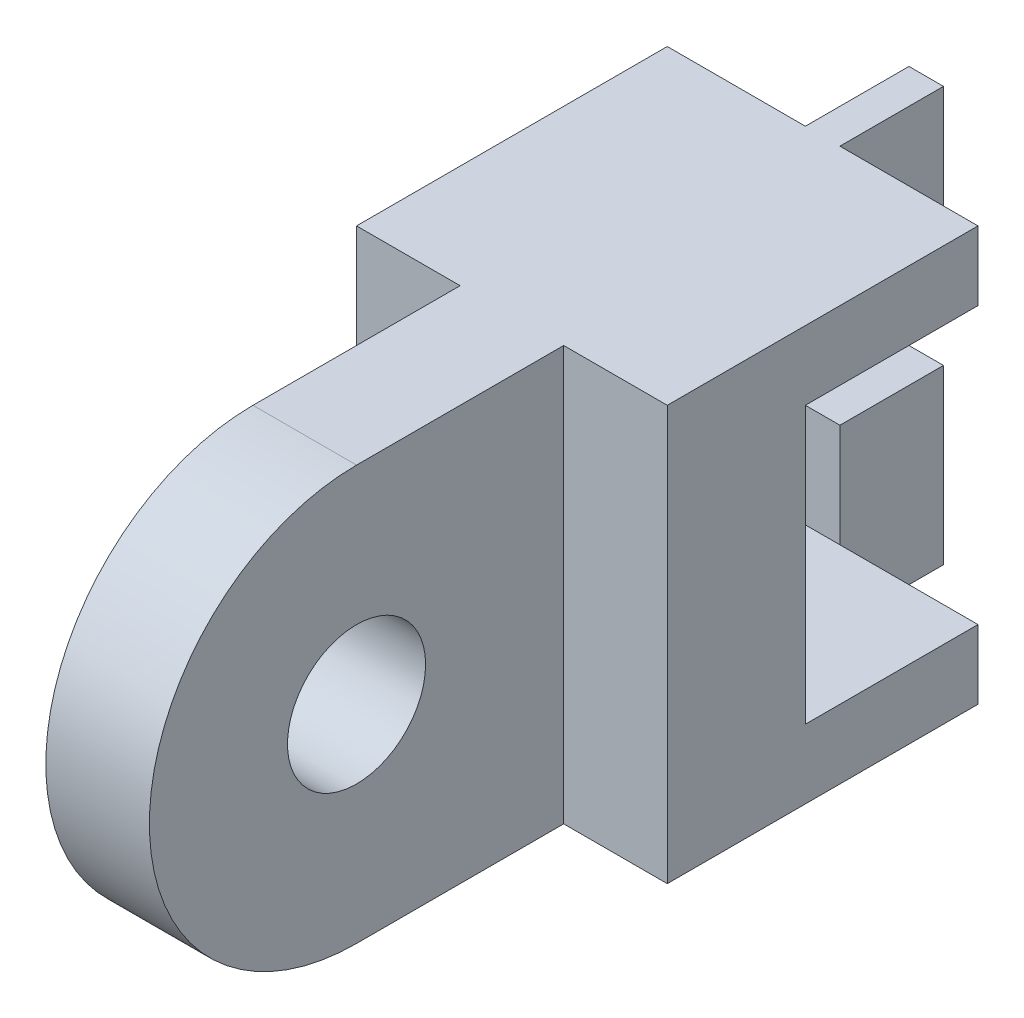
ISO-10303-21;
HEADER;
FILE_DESCRIPTION(('STEP AP214'),'2;1');
FILE_NAME('part.step','',(''),(''),'','','');
FILE_SCHEMA(('AUTOMOTIVE_DESIGN { 1 0 10303 214 1 1 1 1 }'));
ENDSEC;
DATA;
#1=APPLICATION_CONTEXT('core data for automotive mechanical design processes');
#2=APPLICATION_PROTOCOL_DEFINITION('international standard','automotive_design',2000,#1);
#3=PRODUCT_CONTEXT('',#1,'mechanical');
#4=PRODUCT('Part','Part','',(#3));
#5=PRODUCT_RELATED_PRODUCT_CATEGORY('part','',(#4));
#6=PRODUCT_DEFINITION_FORMATION('','',#4);
#7=PRODUCT_DEFINITION_CONTEXT('part definition',#1,'design');
#8=PRODUCT_DEFINITION('design','',#6,#7);
#9=PRODUCT_DEFINITION_SHAPE('','',#8);
#10=(LENGTH_UNIT() NAMED_UNIT(*) SI_UNIT(.MILLI.,.METRE.));
#11=(NAMED_UNIT(*) PLANE_ANGLE_UNIT() SI_UNIT($,.RADIAN.));
#12=(NAMED_UNIT(*) SI_UNIT($,.STERADIAN.) SOLID_ANGLE_UNIT());
#13=UNCERTAINTY_MEASURE_WITH_UNIT(LENGTH_MEASURE(1.E-05),#10,'distance_accuracy_value','');
#14=(GEOMETRIC_REPRESENTATION_CONTEXT(3) GLOBAL_UNCERTAINTY_ASSIGNED_CONTEXT((#13)) GLOBAL_UNIT_ASSIGNED_CONTEXT((#10,
#11,#12)) REPRESENTATION_CONTEXT('',''));
#15=CARTESIAN_POINT('',(0.,0.,0.));
#16=DIRECTION('',(0.,0.,1.));
#17=DIRECTION('',(1.,0.,0.));
#18=AXIS2_PLACEMENT_3D('',#15,#16,#17);
#19=CARTESIAN_POINT('',(-112.5,0.,-375.));
#20=DIRECTION('',(0.,0.,1.));
#21=DIRECTION('',(1.,0.,0.));
#22=AXIS2_PLACEMENT_3D('',#19,#20,#21);
#23=PLANE('',#22);
#24=DIRECTION('',(0.,1.,0.));
#25=VECTOR('',#24,1.);
#26=CARTESIAN_POINT('',(-12.5,2.77555756156289E-13,-375.));
#27=LINE('',#26,#25);
#28=CARTESIAN_POINT('',(-12.5,-150.,-375.));
#29=VERTEX_POINT('',#28);
#30=CARTESIAN_POINT('',(-12.5,-100.,-375.));
#31=VERTEX_POINT('',#30);
#32=EDGE_CURVE('E202',#29,#31,#27,.T.);
#33=ORIENTED_EDGE('',*,*,#32,.F.);
#34=DIRECTION('',(1.,0.,0.));
#35=VECTOR('',#34,1.);
#36=CARTESIAN_POINT('',(-112.5,-150.,-375.));
#37=LINE('',#36,#35);
#38=CARTESIAN_POINT('',(-112.5,-150.,-375.));
#39=VERTEX_POINT('',#38);
#40=EDGE_CURVE('E329',#39,#29,#37,.T.);
#41=ORIENTED_EDGE('',*,*,#40,.F.);
#42=DIRECTION('',(0.,-1.,0.));
#43=VECTOR('',#42,1.);
#44=CARTESIAN_POINT('',(-112.5,0.,-375.));
#45=LINE('',#44,#43);
#46=CARTESIAN_POINT('',(-112.5,-100.,-375.));
#47=VERTEX_POINT('',#46);
#48=EDGE_CURVE('E287',#47,#39,#45,.T.);
#49=ORIENTED_EDGE('',*,*,#48,.F.);
#50=DIRECTION('',(1.,0.,0.));
#51=VECTOR('',#50,1.);
#52=CARTESIAN_POINT('',(-112.5,-100.,-375.));
#53=LINE('',#52,#51);
#54=EDGE_CURVE('E324',#47,#31,#53,.T.);
#55=ORIENTED_EDGE('',*,*,#54,.T.);
#56=EDGE_LOOP('',(#33,#41,#49,#55));
#57=FACE_BOUND('',#56,.T.);
#58=ADVANCED_FACE('F43',(#57),#23,.F.);
#59=CARTESIAN_POINT('',(-112.5,0.,-375.));
#60=DIRECTION('',(0.,0.,1.));
#61=DIRECTION('',(1.,0.,0.));
#62=AXIS2_PLACEMENT_3D('',#59,#60,#61);
#63=PLANE('',#62);
#64=DIRECTION('',(0.,-1.,0.));
#65=VECTOR('',#64,1.);
#66=CARTESIAN_POINT('',(-12.5,0.,-375.));
#67=LINE('',#66,#65);
#68=CARTESIAN_POINT('',(-12.5,150.,-375.));
#69=VERTEX_POINT('',#68);
#70=CARTESIAN_POINT('',(-12.5,100.,-375.));
#71=VERTEX_POINT('',#70);
#72=EDGE_CURVE('E243',#69,#71,#67,.T.);
#73=ORIENTED_EDGE('',*,*,#72,.T.);
#74=DIRECTION('',(1.,0.,0.));
#75=VECTOR('',#74,1.);
#76=CARTESIAN_POINT('',(-112.5,100.,-375.));
#77=LINE('',#76,#75);
#78=CARTESIAN_POINT('',(-112.5,100.,-375.));
#79=VERTEX_POINT('',#78);
#80=EDGE_CURVE('E315',#79,#71,#77,.T.);
#81=ORIENTED_EDGE('',*,*,#80,.F.);
#82=DIRECTION('',(0.,-1.,0.));
#83=VECTOR('',#82,1.);
#84=CARTESIAN_POINT('',(-112.5,0.,-375.));
#85=LINE('',#84,#83);
#86=CARTESIAN_POINT('',(-112.5,150.,-375.));
#87=VERTEX_POINT('',#86);
#88=EDGE_CURVE('E295',#87,#79,#85,.T.);
#89=ORIENTED_EDGE('',*,*,#88,.F.);
#90=DIRECTION('',(1.,0.,0.));
#91=VECTOR('',#90,1.);
#92=CARTESIAN_POINT('',(-112.5,150.,-375.));
#93=LINE('',#92,#91);
#94=EDGE_CURVE('E311',#87,#69,#93,.T.);
#95=ORIENTED_EDGE('',*,*,#94,.T.);
#96=EDGE_LOOP('',(#73,#81,#89,#95));
#97=FACE_BOUND('',#96,.T.);
#98=ADVANCED_FACE('F401',(#97),#63,.F.);
#99=CARTESIAN_POINT('',(-37.5,150.,0.));
#100=DIRECTION('',(0.,-1.,0.));
#101=DIRECTION('',(0.,0.,-1.));
#102=AXIS2_PLACEMENT_3D('',#99,#100,#101);
#103=PLANE('',#102);
#104=DIRECTION('',(1.,0.,0.));
#105=VECTOR('',#104,1.);
#106=CARTESIAN_POINT('',(-37.5,150.,0.));
#107=LINE('',#106,#105);
#108=CARTESIAN_POINT('',(-37.5,150.,0.));
#109=VERTEX_POINT('',#108);
#110=CARTESIAN_POINT('',(37.5,150.,0.));
#111=VERTEX_POINT('',#110);
#112=EDGE_CURVE('E47',#109,#111,#107,.T.);
#113=ORIENTED_EDGE('',*,*,#112,.T.);
#114=DIRECTION('',(0.,0.,-1.));
#115=VECTOR('',#114,1.);
#116=CARTESIAN_POINT('',(37.5,150.,0.));
#117=LINE('',#116,#115);
#118=CARTESIAN_POINT('',(37.5,150.,-150.));
#119=VERTEX_POINT('',#118);
#120=EDGE_CURVE('E333',#111,#119,#117,.T.);
#121=ORIENTED_EDGE('',*,*,#120,.T.);
#122=DIRECTION('',(1.,0.,0.));
#123=VECTOR('',#122,1.);
#124=CARTESIAN_POINT('',(-112.5,150.,-150.));
#125=LINE('',#124,#123);
#126=CARTESIAN_POINT('',(112.5,150.,-150.));
#127=VERTEX_POINT('',#126);
#128=EDGE_CURVE('E310',#119,#127,#125,.T.);
#129=ORIENTED_EDGE('',*,*,#128,.T.);
#130=DIRECTION('',(0.,0.,-1.));
#131=VECTOR('',#130,1.);
#132=CARTESIAN_POINT('',(112.5,150.,0.));
#133=LINE('',#132,#131);
#134=CARTESIAN_POINT('',(112.5,150.,-375.));
#135=VERTEX_POINT('',#134);
#136=EDGE_CURVE('E278',#127,#135,#133,.T.);
#137=ORIENTED_EDGE('',*,*,#136,.T.);
#138=CARTESIAN_POINT('',(12.5,150.,-375.));
#139=VERTEX_POINT('',#138);
#140=EDGE_CURVE('E314',#139,#135,#93,.T.);
#141=ORIENTED_EDGE('',*,*,#140,.F.);
#142=DIRECTION('',(0.,0.,-1.));
#143=VECTOR('',#142,1.);
#144=CARTESIAN_POINT('',(12.5,150.,0.));
#145=LINE('',#144,#143);
#146=CARTESIAN_POINT('',(12.5,150.,-450.));
#147=VERTEX_POINT('',#146);
#148=EDGE_CURVE('E239',#139,#147,#145,.T.);
#149=ORIENTED_EDGE('',*,*,#148,.T.);
#150=DIRECTION('',(1.,0.,0.));
#151=VECTOR('',#150,1.);
#152=CARTESIAN_POINT('',(-12.5,150.,-450.));
#153=LINE('',#152,#151);
#154=CARTESIAN_POINT('',(-12.5,150.,-450.));
#155=VERTEX_POINT('',#154);
#156=EDGE_CURVE('E254',#155,#147,#153,.T.);
#157=ORIENTED_EDGE('',*,*,#156,.F.);
#158=DIRECTION('',(0.,0.,-1.));
#159=VECTOR('',#158,1.);
#160=CARTESIAN_POINT('',(-12.5,150.,0.));
#161=LINE('',#160,#159);
#162=EDGE_CURVE('E251',#69,#155,#161,.T.);
#163=ORIENTED_EDGE('',*,*,#162,.F.);
#164=ORIENTED_EDGE('',*,*,#94,.F.);
#165=DIRECTION('',(0.,0.,-1.));
#166=VECTOR('',#165,1.);
#167=CARTESIAN_POINT('',(-112.5,150.,0.));
#168=LINE('',#167,#166);
#169=CARTESIAN_POINT('',(-112.5,150.,-150.));
#170=VERTEX_POINT('',#169);
#171=EDGE_CURVE('E297',#170,#87,#168,.T.);
#172=ORIENTED_EDGE('',*,*,#171,.F.);
#173=CARTESIAN_POINT('',(-37.5,150.,-150.));
#174=VERTEX_POINT('',#173);
#175=EDGE_CURVE('E307',#170,#174,#125,.T.);
#176=ORIENTED_EDGE('',*,*,#175,.T.);
#177=DIRECTION('',(0.,0.,-1.));
#178=VECTOR('',#177,1.);
#179=CARTESIAN_POINT('',(-37.5,150.,0.));
#180=LINE('',#179,#178);
#181=EDGE_CURVE('E346',#109,#174,#180,.T.);
#182=ORIENTED_EDGE('',*,*,#181,.F.);
#183=EDGE_LOOP('',(#113,#121,#129,#137,#141,#149,#157,#163,#164,#172,#176,#182));
#184=FACE_BOUND('',#183,.T.);
#185=ADVANCED_FACE('F361',(#184),#103,.F.);
#186=CARTESIAN_POINT('',(-37.5,-150.,0.));
#187=DIRECTION('',(0.,-1.,0.));
#188=DIRECTION('',(0.,0.,-1.));
#189=AXIS2_PLACEMENT_3D('',#186,#187,#188);
#190=PLANE('',#189);
#191=DIRECTION('',(0.,0.,-1.));
#192=VECTOR('',#191,1.);
#193=CARTESIAN_POINT('',(-37.5,-150.,0.));
#194=LINE('',#193,#192);
#195=CARTESIAN_POINT('',(-37.5,-150.,0.));
#196=VERTEX_POINT('',#195);
#197=CARTESIAN_POINT('',(-37.5,-150.,-150.));
#198=VERTEX_POINT('',#197);
#199=EDGE_CURVE('E351',#196,#198,#194,.T.);
#200=ORIENTED_EDGE('',*,*,#199,.T.);
#201=DIRECTION('',(1.,0.,0.));
#202=VECTOR('',#201,1.);
#203=CARTESIAN_POINT('',(-112.5,-150.,-150.));
#204=LINE('',#203,#202);
#205=CARTESIAN_POINT('',(-112.5,-150.,-150.));
#206=VERTEX_POINT('',#205);
#207=EDGE_CURVE('E302',#206,#198,#204,.T.);
#208=ORIENTED_EDGE('',*,*,#207,.F.);
#209=DIRECTION('',(0.,0.,1.));
#210=VECTOR('',#209,1.);
#211=CARTESIAN_POINT('',(-112.5,-150.,0.));
#212=LINE('',#211,#210);
#213=EDGE_CURVE('E284',#39,#206,#212,.T.);
#214=ORIENTED_EDGE('',*,*,#213,.F.);
#215=ORIENTED_EDGE('',*,*,#40,.T.);
#216=DIRECTION('',(0.,0.,1.));
#217=VECTOR('',#216,1.);
#218=CARTESIAN_POINT('',(-12.5,-150.,0.));
#219=LINE('',#218,#217);
#220=CARTESIAN_POINT('',(-12.5,-150.,-450.));
#221=VERTEX_POINT('',#220);
#222=EDGE_CURVE('E197',#221,#29,#219,.T.);
#223=ORIENTED_EDGE('',*,*,#222,.F.);
#224=DIRECTION('',(1.,0.,0.));
#225=VECTOR('',#224,1.);
#226=CARTESIAN_POINT('',(-12.5,-150.,-450.));
#227=LINE('',#226,#225);
#228=CARTESIAN_POINT('',(12.5,-150.,-450.));
#229=VERTEX_POINT('',#228);
#230=EDGE_CURVE('E192',#221,#229,#227,.T.);
#231=ORIENTED_EDGE('',*,*,#230,.T.);
#232=DIRECTION('',(0.,0.,1.));
#233=VECTOR('',#232,1.);
#234=CARTESIAN_POINT('',(12.5,-150.,0.));
#235=LINE('',#234,#233);
#236=CARTESIAN_POINT('',(12.5,-150.,-375.));
#237=VERTEX_POINT('',#236);
#238=EDGE_CURVE('E195',#229,#237,#235,.T.);
#239=ORIENTED_EDGE('',*,*,#238,.T.);
#240=CARTESIAN_POINT('',(112.5,-150.,-375.));
#241=VERTEX_POINT('',#240);
#242=EDGE_CURVE('E301',#237,#241,#37,.T.);
#243=ORIENTED_EDGE('',*,*,#242,.T.);
#244=DIRECTION('',(0.,0.,1.));
#245=VECTOR('',#244,1.);
#246=CARTESIAN_POINT('',(112.5,-150.,0.));
#247=LINE('',#246,#245);
#248=CARTESIAN_POINT('',(112.5,-150.,-150.));
#249=VERTEX_POINT('',#248);
#250=EDGE_CURVE('E256',#241,#249,#247,.T.);
#251=ORIENTED_EDGE('',*,*,#250,.T.);
#252=CARTESIAN_POINT('',(37.5,-150.,-150.));
#253=VERTEX_POINT('',#252);
#254=EDGE_CURVE('E306',#253,#249,#204,.T.);
#255=ORIENTED_EDGE('',*,*,#254,.F.);
#256=DIRECTION('',(0.,0.,-1.));
#257=VECTOR('',#256,1.);
#258=CARTESIAN_POINT('',(37.5,-150.,0.));
#259=LINE('',#258,#257);
#260=CARTESIAN_POINT('',(37.5,-150.,0.));
#261=VERTEX_POINT('',#260);
#262=EDGE_CURVE('E339',#261,#253,#259,.T.);
#263=ORIENTED_EDGE('',*,*,#262,.F.);
#264=DIRECTION('',(1.,0.,0.));
#265=VECTOR('',#264,1.);
#266=CARTESIAN_POINT('',(-37.5,-150.,0.));
#267=LINE('',#266,#265);
#268=EDGE_CURVE('E11',#196,#261,#267,.T.);
#269=ORIENTED_EDGE('',*,*,#268,.F.);
#270=EDGE_LOOP('',(#200,#208,#214,#215,#223,#231,#239,#243,#251,#255,#263,#269));
#271=FACE_BOUND('',#270,.T.);
#272=ADVANCED_FACE('F194',(#271),#190,.T.);
#273=CARTESIAN_POINT('',(-37.5,0.,0.));
#274=DIRECTION('',(1.,0.,0.));
#275=DIRECTION('',(0.,0.,-1.));
#276=AXIS2_PLACEMENT_3D('',#273,#274,#275);
#277=CYLINDRICAL_SURFACE('',#276,50.);
#278=CARTESIAN_POINT('',(-37.5,0.,0.));
#279=DIRECTION('',(1.,0.,0.));
#280=DIRECTION('',(0.,0.,-1.));
#281=AXIS2_PLACEMENT_3D('',#278,#279,#280);
#282=CIRCLE('',#281,50.);
#283=CARTESIAN_POINT('',(-37.5,0.,-50.));
#284=VERTEX_POINT('',#283);
#285=EDGE_CURVE('E343',#284,#284,#282,.T.);
#286=ORIENTED_EDGE('',*,*,#285,.F.);
#287=EDGE_LOOP('',(#286));
#288=FACE_BOUND('',#287,.T.);
#289=CARTESIAN_POINT('',(37.5,0.,0.));
#290=DIRECTION('',(1.,0.,0.));
#291=DIRECTION('',(0.,0.,-1.));
#292=AXIS2_PLACEMENT_3D('',#289,#290,#291);
#293=CIRCLE('',#292,50.);
#294=CARTESIAN_POINT('',(37.5,0.,-50.));
#295=VERTEX_POINT('',#294);
#296=EDGE_CURVE('E305',#295,#295,#293,.T.);
#297=ORIENTED_EDGE('',*,*,#296,.T.);
#298=EDGE_LOOP('',(#297));
#299=FACE_BOUND('',#298,.T.);
#300=ADVANCED_FACE('F45',(#288,#299),#277,.F.);
#301=CARTESIAN_POINT('',(-37.5,0.,0.));
#302=DIRECTION('',(1.,0.,0.));
#303=DIRECTION('',(0.,0.,-1.));
#304=AXIS2_PLACEMENT_3D('',#301,#302,#303);
#305=CYLINDRICAL_SURFACE('',#304,150.);
#306=ORIENTED_EDGE('',*,*,#268,.T.);
#307=CARTESIAN_POINT('',(37.5,0.,0.));
#308=DIRECTION('',(1.,0.,0.));
#309=DIRECTION('',(0.,0.,-1.));
#310=AXIS2_PLACEMENT_3D('',#307,#308,#309);
#311=CIRCLE('',#310,150.);
#312=EDGE_CURVE('E336',#111,#261,#311,.T.);
#313=ORIENTED_EDGE('',*,*,#312,.F.);
#314=ORIENTED_EDGE('',*,*,#112,.F.);
#315=CARTESIAN_POINT('',(-37.5,0.,0.));
#316=DIRECTION('',(1.,0.,0.));
#317=DIRECTION('',(0.,0.,-1.));
#318=AXIS2_PLACEMENT_3D('',#315,#316,#317);
#319=CIRCLE('',#318,150.);
#320=EDGE_CURVE('E348',#109,#196,#319,.T.);
#321=ORIENTED_EDGE('',*,*,#320,.T.);
#322=EDGE_LOOP('',(#306,#313,#314,#321));
#323=FACE_BOUND('',#322,.T.);
#324=ADVANCED_FACE('F366',(#323),#305,.T.);
#325=CARTESIAN_POINT('',(-37.5,0.,0.));
#326=DIRECTION('',(1.,0.,0.));
#327=DIRECTION('',(0.,0.,-1.));
#328=AXIS2_PLACEMENT_3D('',#325,#326,#327);
#329=PLANE('',#328);
#330=ORIENTED_EDGE('',*,*,#285,.T.);
#331=EDGE_LOOP('',(#330));
#332=FACE_BOUND('',#331,.T.);
#333=ORIENTED_EDGE('',*,*,#181,.T.);
#334=DIRECTION('',(0.,1.,0.));
#335=VECTOR('',#334,1.);
#336=CARTESIAN_POINT('',(-37.5,0.,-150.));
#337=LINE('',#336,#335);
#338=EDGE_CURVE('E353',#198,#174,#337,.T.);
#339=ORIENTED_EDGE('',*,*,#338,.F.);
#340=ORIENTED_EDGE('',*,*,#199,.F.);
#341=ORIENTED_EDGE('',*,*,#320,.F.);
#342=EDGE_LOOP('',(#333,#339,#340,#341));
#343=FACE_BOUND('',#342,.T.);
#344=ADVANCED_FACE('F468',(#332,#343),#329,.F.);
#345=CARTESIAN_POINT('',(37.5,0.,0.));
#346=DIRECTION('',(1.,0.,0.));
#347=DIRECTION('',(0.,0.,-1.));
#348=AXIS2_PLACEMENT_3D('',#345,#346,#347);
#349=PLANE('',#348);
#350=ORIENTED_EDGE('',*,*,#296,.F.);
#351=EDGE_LOOP('',(#350));
#352=FACE_BOUND('',#351,.T.);
#353=ORIENTED_EDGE('',*,*,#120,.F.);
#354=ORIENTED_EDGE('',*,*,#312,.T.);
#355=ORIENTED_EDGE('',*,*,#262,.T.);
#356=DIRECTION('',(0.,1.,0.));
#357=VECTOR('',#356,1.);
#358=CARTESIAN_POINT('',(37.5,0.,-150.));
#359=LINE('',#358,#357);
#360=EDGE_CURVE('E341',#253,#119,#359,.T.);
#361=ORIENTED_EDGE('',*,*,#360,.T.);
#362=EDGE_LOOP('',(#353,#354,#355,#361));
#363=FACE_BOUND('',#362,.T.);
#364=ADVANCED_FACE('F369',(#352,#363),#349,.T.);
#365=CARTESIAN_POINT('',(-112.5,0.,-150.));
#366=DIRECTION('',(0.,0.,-1.));
#367=DIRECTION('',(-1.,0.,0.));
#368=AXIS2_PLACEMENT_3D('',#365,#366,#367);
#369=PLANE('',#368);
#370=ORIENTED_EDGE('',*,*,#207,.T.);
#371=ORIENTED_EDGE('',*,*,#338,.T.);
#372=ORIENTED_EDGE('',*,*,#175,.F.);
#373=DIRECTION('',(0.,1.,0.));
#374=VECTOR('',#373,1.);
#375=CARTESIAN_POINT('',(-112.5,0.,-150.));
#376=LINE('',#375,#374);
#377=EDGE_CURVE('E299',#206,#170,#376,.T.);
#378=ORIENTED_EDGE('',*,*,#377,.F.);
#379=EDGE_LOOP('',(#370,#371,#372,#378));
#380=FACE_BOUND('',#379,.T.);
#381=ADVANCED_FACE('F461',(#380),#369,.F.);
#382=ORIENTED_EDGE('',*,*,#360,.F.);
#383=ORIENTED_EDGE('',*,*,#254,.T.);
#384=DIRECTION('',(0.,1.,0.));
#385=VECTOR('',#384,1.);
#386=CARTESIAN_POINT('',(112.5,0.,-150.));
#387=LINE('',#386,#385);
#388=EDGE_CURVE('E281',#249,#127,#387,.T.);
#389=ORIENTED_EDGE('',*,*,#388,.T.);
#390=ORIENTED_EDGE('',*,*,#128,.F.);
#391=EDGE_LOOP('',(#382,#383,#389,#390));
#392=FACE_BOUND('',#391,.T.);
#393=ADVANCED_FACE('F373',(#392),#369,.F.);
#394=CARTESIAN_POINT('',(12.5,100.,-375.));
#395=VERTEX_POINT('',#394);
#396=CARTESIAN_POINT('',(112.5,100.,-375.));
#397=VERTEX_POINT('',#396);
#398=EDGE_CURVE('E319',#395,#397,#77,.T.);
#399=ORIENTED_EDGE('',*,*,#398,.F.);
#400=DIRECTION('',(0.,-1.,0.));
#401=VECTOR('',#400,1.);
#402=CARTESIAN_POINT('',(12.5,0.,-375.));
#403=LINE('',#402,#401);
#404=EDGE_CURVE('E66',#139,#395,#403,.T.);
#405=ORIENTED_EDGE('',*,*,#404,.F.);
#406=ORIENTED_EDGE('',*,*,#140,.T.);
#407=DIRECTION('',(0.,-1.,0.));
#408=VECTOR('',#407,1.);
#409=CARTESIAN_POINT('',(112.5,0.,-375.));
#410=LINE('',#409,#408);
#411=EDGE_CURVE('E275',#135,#397,#410,.T.);
#412=ORIENTED_EDGE('',*,*,#411,.T.);
#413=EDGE_LOOP('',(#399,#405,#406,#412));
#414=FACE_BOUND('',#413,.T.);
#415=ADVANCED_FACE('F386',(#414),#63,.F.);
#416=CARTESIAN_POINT('',(-112.5,99.9999999999999,0.));
#417=DIRECTION('',(0.,1.,0.));
#418=DIRECTION('',(0.,0.,1.));
#419=AXIS2_PLACEMENT_3D('',#416,#417,#418);
#420=PLANE('',#419);
#421=ORIENTED_EDGE('',*,*,#80,.T.);
#422=EDGE_CURVE('E318',#71,#395,#77,.T.);
#423=ORIENTED_EDGE('',*,*,#422,.T.);
#424=ORIENTED_EDGE('',*,*,#398,.T.);
#425=DIRECTION('',(0.,0.,1.));
#426=VECTOR('',#425,1.);
#427=CARTESIAN_POINT('',(112.5,99.9999999999999,0.));
#428=LINE('',#427,#426);
#429=CARTESIAN_POINT('',(112.5,100.,-250.));
#430=VERTEX_POINT('',#429);
#431=EDGE_CURVE('E272',#397,#430,#428,.T.);
#432=ORIENTED_EDGE('',*,*,#431,.T.);
#433=DIRECTION('',(1.,0.,0.));
#434=VECTOR('',#433,1.);
#435=CARTESIAN_POINT('',(-112.5,100.,-250.));
#436=LINE('',#435,#434);
#437=CARTESIAN_POINT('',(-112.5,100.,-250.));
#438=VERTEX_POINT('',#437);
#439=EDGE_CURVE('E320',#438,#430,#436,.T.);
#440=ORIENTED_EDGE('',*,*,#439,.F.);
#441=DIRECTION('',(0.,0.,1.));
#442=VECTOR('',#441,1.);
#443=CARTESIAN_POINT('',(-112.5,99.9999999999999,0.));
#444=LINE('',#443,#442);
#445=EDGE_CURVE('E293',#79,#438,#444,.T.);
#446=ORIENTED_EDGE('',*,*,#445,.F.);
#447=EDGE_LOOP('',(#421,#423,#424,#432,#440,#446));
#448=FACE_BOUND('',#447,.T.);
#449=ADVANCED_FACE('F389',(#448),#420,.F.);
#450=CARTESIAN_POINT('',(-112.5,0.,-250.));
#451=DIRECTION('',(0.,0.,1.));
#452=DIRECTION('',(1.,0.,0.));
#453=AXIS2_PLACEMENT_3D('',#450,#451,#452);
#454=PLANE('',#453);
#455=ORIENTED_EDGE('',*,*,#439,.T.);
#456=DIRECTION('',(0.,-1.,0.));
#457=VECTOR('',#456,1.);
#458=CARTESIAN_POINT('',(112.5,0.,-250.));
#459=LINE('',#458,#457);
#460=CARTESIAN_POINT('',(112.5,-100.,-250.));
#461=VERTEX_POINT('',#460);
#462=EDGE_CURVE('E269',#430,#461,#459,.T.);
#463=ORIENTED_EDGE('',*,*,#462,.T.);
#464=DIRECTION('',(1.,0.,0.));
#465=VECTOR('',#464,1.);
#466=CARTESIAN_POINT('',(-112.5,-100.,-250.));
#467=LINE('',#466,#465);
#468=CARTESIAN_POINT('',(-112.5,-100.,-250.));
#469=VERTEX_POINT('',#468);
#470=EDGE_CURVE('E322',#469,#461,#467,.T.);
#471=ORIENTED_EDGE('',*,*,#470,.F.);
#472=DIRECTION('',(0.,-1.,0.));
#473=VECTOR('',#472,1.);
#474=CARTESIAN_POINT('',(-112.5,0.,-250.));
#475=LINE('',#474,#473);
#476=EDGE_CURVE('E291',#438,#469,#475,.T.);
#477=ORIENTED_EDGE('',*,*,#476,.F.);
#478=EDGE_LOOP('',(#455,#463,#471,#477));
#479=FACE_BOUND('',#478,.T.);
#480=ADVANCED_FACE('F447',(#479),#454,.F.);
#481=CARTESIAN_POINT('',(-112.5,-99.9999999999999,0.));
#482=DIRECTION('',(0.,-1.,0.));
#483=DIRECTION('',(0.,0.,-1.));
#484=AXIS2_PLACEMENT_3D('',#481,#482,#483);
#485=PLANE('',#484);
#486=ORIENTED_EDGE('',*,*,#470,.T.);
#487=DIRECTION('',(0.,0.,-1.));
#488=VECTOR('',#487,1.);
#489=CARTESIAN_POINT('',(112.5,-99.9999999999999,0.));
#490=LINE('',#489,#488);
#491=CARTESIAN_POINT('',(112.5,-100.,-375.));
#492=VERTEX_POINT('',#491);
#493=EDGE_CURVE('E266',#461,#492,#490,.T.);
#494=ORIENTED_EDGE('',*,*,#493,.T.);
#495=CARTESIAN_POINT('',(12.5,-100.,-375.));
#496=VERTEX_POINT('',#495);
#497=EDGE_CURVE('E328',#496,#492,#53,.T.);
#498=ORIENTED_EDGE('',*,*,#497,.F.);
#499=EDGE_CURVE('E327',#31,#496,#53,.T.);
#500=ORIENTED_EDGE('',*,*,#499,.F.);
#501=ORIENTED_EDGE('',*,*,#54,.F.);
#502=DIRECTION('',(0.,0.,-1.));
#503=VECTOR('',#502,1.);
#504=CARTESIAN_POINT('',(-112.5,-99.9999999999999,0.));
#505=LINE('',#504,#503);
#506=EDGE_CURVE('E289',#469,#47,#505,.T.);
#507=ORIENTED_EDGE('',*,*,#506,.F.);
#508=EDGE_LOOP('',(#486,#494,#498,#500,#501,#507));
#509=FACE_BOUND('',#508,.T.);
#510=ADVANCED_FACE('F439',(#509),#485,.F.);
#511=ORIENTED_EDGE('',*,*,#242,.F.);
#512=DIRECTION('',(0.,1.,0.));
#513=VECTOR('',#512,1.);
#514=CARTESIAN_POINT('',(12.5,2.77555756156289E-13,-375.));
#515=LINE('',#514,#513);
#516=EDGE_CURVE('E209',#237,#496,#515,.T.);
#517=ORIENTED_EDGE('',*,*,#516,.T.);
#518=ORIENTED_EDGE('',*,*,#497,.T.);
#519=DIRECTION('',(0.,-1.,0.));
#520=VECTOR('',#519,1.);
#521=CARTESIAN_POINT('',(112.5,0.,-375.));
#522=LINE('',#521,#520);
#523=EDGE_CURVE('E263',#492,#241,#522,.T.);
#524=ORIENTED_EDGE('',*,*,#523,.T.);
#525=EDGE_LOOP('',(#511,#517,#518,#524));
#526=FACE_BOUND('',#525,.T.);
#527=ADVANCED_FACE('F429',(#526),#23,.F.);
#528=CARTESIAN_POINT('',(-112.5,0.,0.));
#529=DIRECTION('',(1.,0.,0.));
#530=DIRECTION('',(0.,0.,-1.));
#531=AXIS2_PLACEMENT_3D('',#528,#529,#530);
#532=PLANE('',#531);
#533=ORIENTED_EDGE('',*,*,#213,.T.);
#534=ORIENTED_EDGE('',*,*,#377,.T.);
#535=ORIENTED_EDGE('',*,*,#171,.T.);
#536=ORIENTED_EDGE('',*,*,#88,.T.);
#537=ORIENTED_EDGE('',*,*,#445,.T.);
#538=ORIENTED_EDGE('',*,*,#476,.T.);
#539=ORIENTED_EDGE('',*,*,#506,.T.);
#540=ORIENTED_EDGE('',*,*,#48,.T.);
#541=EDGE_LOOP('',(#533,#534,#535,#536,#537,#538,#539,#540));
#542=FACE_BOUND('',#541,.T.);
#543=ADVANCED_FACE('F438',(#542),#532,.F.);
#544=CARTESIAN_POINT('',(112.5,0.,0.));
#545=DIRECTION('',(1.,0.,0.));
#546=DIRECTION('',(0.,0.,-1.));
#547=AXIS2_PLACEMENT_3D('',#544,#545,#546);
#548=PLANE('',#547);
#549=ORIENTED_EDGE('',*,*,#250,.F.);
#550=ORIENTED_EDGE('',*,*,#523,.F.);
#551=ORIENTED_EDGE('',*,*,#493,.F.);
#552=ORIENTED_EDGE('',*,*,#462,.F.);
#553=ORIENTED_EDGE('',*,*,#431,.F.);
#554=ORIENTED_EDGE('',*,*,#411,.F.);
#555=ORIENTED_EDGE('',*,*,#136,.F.);
#556=ORIENTED_EDGE('',*,*,#388,.F.);
#557=EDGE_LOOP('',(#549,#550,#551,#552,#553,#554,#555,#556));
#558=FACE_BOUND('',#557,.T.);
#559=ADVANCED_FACE('F379',(#558),#548,.T.);
#560=CARTESIAN_POINT('',(-12.5,0.,-375.));
#561=DIRECTION('',(0.,0.,1.));
#562=DIRECTION('',(1.,0.,0.));
#563=AXIS2_PLACEMENT_3D('',#560,#561,#562);
#564=PLANE('',#563);
#565=ORIENTED_EDGE('',*,*,#422,.F.);
#566=CARTESIAN_POINT('',(-12.5,75.,-375.));
#567=VERTEX_POINT('',#566);
#568=EDGE_CURVE('E242',#71,#567,#67,.T.);
#569=ORIENTED_EDGE('',*,*,#568,.T.);
#570=DIRECTION('',(1.,0.,0.));
#571=VECTOR('',#570,1.);
#572=CARTESIAN_POINT('',(-12.5,75.,-375.));
#573=LINE('',#572,#571);
#574=CARTESIAN_POINT('',(12.5,75.,-375.));
#575=VERTEX_POINT('',#574);
#576=EDGE_CURVE('E253',#567,#575,#573,.T.);
#577=ORIENTED_EDGE('',*,*,#576,.T.);
#578=EDGE_CURVE('E230',#395,#575,#403,.T.);
#579=ORIENTED_EDGE('',*,*,#578,.F.);
#580=EDGE_LOOP('',(#565,#569,#577,#579));
#581=FACE_BOUND('',#580,.T.);
#582=ADVANCED_FACE('F394',(#581),#564,.T.);
#583=CARTESIAN_POINT('',(-12.5,0.,-450.));
#584=DIRECTION('',(0.,0.,1.));
#585=DIRECTION('',(1.,0.,0.));
#586=AXIS2_PLACEMENT_3D('',#583,#584,#585);
#587=PLANE('',#586);
#588=ORIENTED_EDGE('',*,*,#156,.T.);
#589=DIRECTION('',(0.,-1.,0.));
#590=VECTOR('',#589,1.);
#591=CARTESIAN_POINT('',(12.5,0.,-450.));
#592=LINE('',#591,#590);
#593=CARTESIAN_POINT('',(12.5,75.,-450.));
#594=VERTEX_POINT('',#593);
#595=EDGE_CURVE('E236',#147,#594,#592,.T.);
#596=ORIENTED_EDGE('',*,*,#595,.T.);
#597=DIRECTION('',(1.,0.,0.));
#598=VECTOR('',#597,1.);
#599=CARTESIAN_POINT('',(-12.5,75.,-450.));
#600=LINE('',#599,#598);
#601=CARTESIAN_POINT('',(-12.5,75.,-450.));
#602=VERTEX_POINT('',#601);
#603=EDGE_CURVE('E257',#602,#594,#600,.T.);
#604=ORIENTED_EDGE('',*,*,#603,.F.);
#605=DIRECTION('',(0.,-1.,0.));
#606=VECTOR('',#605,1.);
#607=CARTESIAN_POINT('',(-12.5,0.,-450.));
#608=LINE('',#607,#606);
#609=EDGE_CURVE('E249',#155,#602,#608,.T.);
#610=ORIENTED_EDGE('',*,*,#609,.F.);
#611=EDGE_LOOP('',(#588,#596,#604,#610));
#612=FACE_BOUND('',#611,.T.);
#613=ADVANCED_FACE('F408',(#612),#587,.F.);
#614=CARTESIAN_POINT('',(-12.5,75.,0.));
#615=DIRECTION('',(0.,-1.,0.));
#616=DIRECTION('',(0.,0.,-1.));
#617=AXIS2_PLACEMENT_3D('',#614,#615,#616);
#618=PLANE('',#617);
#619=ORIENTED_EDGE('',*,*,#603,.T.);
#620=DIRECTION('',(0.,0.,-1.));
#621=VECTOR('',#620,1.);
#622=CARTESIAN_POINT('',(12.5,75.,0.));
#623=LINE('',#622,#621);
#624=EDGE_CURVE('E233',#575,#594,#623,.T.);
#625=ORIENTED_EDGE('',*,*,#624,.F.);
#626=ORIENTED_EDGE('',*,*,#576,.F.);
#627=DIRECTION('',(0.,0.,-1.));
#628=VECTOR('',#627,1.);
#629=CARTESIAN_POINT('',(-12.5,75.,0.));
#630=LINE('',#629,#628);
#631=EDGE_CURVE('E246',#567,#602,#630,.T.);
#632=ORIENTED_EDGE('',*,*,#631,.T.);
#633=EDGE_LOOP('',(#619,#625,#626,#632));
#634=FACE_BOUND('',#633,.T.);
#635=ADVANCED_FACE('F412',(#634),#618,.T.);
#636=CARTESIAN_POINT('',(-12.5,0.,0.));
#637=DIRECTION('',(1.,0.,0.));
#638=DIRECTION('',(0.,0.,-1.));
#639=AXIS2_PLACEMENT_3D('',#636,#637,#638);
#640=PLANE('',#639);
#641=ORIENTED_EDGE('',*,*,#72,.F.);
#642=ORIENTED_EDGE('',*,*,#162,.T.);
#643=ORIENTED_EDGE('',*,*,#609,.T.);
#644=ORIENTED_EDGE('',*,*,#631,.F.);
#645=ORIENTED_EDGE('',*,*,#568,.F.);
#646=EDGE_LOOP('',(#641,#642,#643,#644,#645));
#647=FACE_BOUND('',#646,.T.);
#648=ADVANCED_FACE('F399',(#647),#640,.F.);
#649=CARTESIAN_POINT('',(12.5,0.,0.));
#650=DIRECTION('',(1.,0.,0.));
#651=DIRECTION('',(0.,0.,-1.));
#652=AXIS2_PLACEMENT_3D('',#649,#650,#651);
#653=PLANE('',#652);
#654=ORIENTED_EDGE('',*,*,#404,.T.);
#655=ORIENTED_EDGE('',*,*,#578,.T.);
#656=ORIENTED_EDGE('',*,*,#624,.T.);
#657=ORIENTED_EDGE('',*,*,#595,.F.);
#658=ORIENTED_EDGE('',*,*,#148,.F.);
#659=EDGE_LOOP('',(#654,#655,#656,#657,#658));
#660=FACE_BOUND('',#659,.T.);
#661=ADVANCED_FACE('F413',(#660),#653,.T.);
#662=CARTESIAN_POINT('',(-12.5,2.77555756156289E-13,-375.));
#663=DIRECTION('',(0.,0.,-1.));
#664=DIRECTION('',(0.,1.,0.));
#665=AXIS2_PLACEMENT_3D('',#662,#663,#664);
#666=PLANE('',#665);
#667=CARTESIAN_POINT('',(-12.5,-25.,-375.));
#668=VERTEX_POINT('',#667);
#669=EDGE_CURVE('E224',#31,#668,#27,.T.);
#670=ORIENTED_EDGE('',*,*,#669,.F.);
#671=ORIENTED_EDGE('',*,*,#499,.T.);
#672=CARTESIAN_POINT('',(12.5,-25.,-375.));
#673=VERTEX_POINT('',#672);
#674=EDGE_CURVE('E58',#496,#673,#515,.T.);
#675=ORIENTED_EDGE('',*,*,#674,.T.);
#676=DIRECTION('',(1.,0.,0.));
#677=VECTOR('',#676,1.);
#678=CARTESIAN_POINT('',(-12.5,-25.,-375.));
#679=LINE('',#678,#677);
#680=EDGE_CURVE('E227',#668,#673,#679,.T.);
#681=ORIENTED_EDGE('',*,*,#680,.F.);
#682=EDGE_LOOP('',(#670,#671,#675,#681));
#683=FACE_BOUND('',#682,.T.);
#684=ADVANCED_FACE('F415',(#683),#666,.F.);
#685=CARTESIAN_POINT('',(-12.5,-25.,0.));
#686=DIRECTION('',(0.,-1.,0.));
#687=DIRECTION('',(0.,0.,-1.));
#688=AXIS2_PLACEMENT_3D('',#685,#686,#687);
#689=PLANE('',#688);
#690=ORIENTED_EDGE('',*,*,#680,.T.);
#691=DIRECTION('',(0.,0.,-1.));
#692=VECTOR('',#691,1.);
#693=CARTESIAN_POINT('',(12.5,-25.,0.));
#694=LINE('',#693,#692);
#695=CARTESIAN_POINT('',(12.5,-25.,-450.));
#696=VERTEX_POINT('',#695);
#697=EDGE_CURVE('E214',#673,#696,#694,.T.);
#698=ORIENTED_EDGE('',*,*,#697,.T.);
#699=DIRECTION('',(1.,0.,0.));
#700=VECTOR('',#699,1.);
#701=CARTESIAN_POINT('',(-12.5,-25.,-450.));
#702=LINE('',#701,#700);
#703=CARTESIAN_POINT('',(-12.5,-25.,-450.));
#704=VERTEX_POINT('',#703);
#705=EDGE_CURVE('E201',#704,#696,#702,.T.);
#706=ORIENTED_EDGE('',*,*,#705,.F.);
#707=DIRECTION('',(0.,0.,-1.));
#708=VECTOR('',#707,1.);
#709=CARTESIAN_POINT('',(-12.5,-25.,0.));
#710=LINE('',#709,#708);
#711=EDGE_CURVE('E222',#668,#704,#710,.T.);
#712=ORIENTED_EDGE('',*,*,#711,.F.);
#713=EDGE_LOOP('',(#690,#698,#706,#712));
#714=FACE_BOUND('',#713,.T.);
#715=ADVANCED_FACE('F421',(#714),#689,.F.);
#716=CARTESIAN_POINT('',(-12.5,-1.99840144432528E-13,-450.));
#717=DIRECTION('',(0.,0.,1.));
#718=DIRECTION('',(0.,-1.,0.));
#719=AXIS2_PLACEMENT_3D('',#716,#717,#718);
#720=PLANE('',#719);
#721=ORIENTED_EDGE('',*,*,#705,.T.);
#722=DIRECTION('',(0.,-1.,0.));
#723=VECTOR('',#722,1.);
#724=CARTESIAN_POINT('',(12.5,-1.99840144432528E-13,-450.));
#725=LINE('',#724,#723);
#726=EDGE_CURVE('E206',#696,#229,#725,.T.);
#727=ORIENTED_EDGE('',*,*,#726,.T.);
#728=ORIENTED_EDGE('',*,*,#230,.F.);
#729=DIRECTION('',(0.,-1.,0.));
#730=VECTOR('',#729,1.);
#731=CARTESIAN_POINT('',(-12.5,-1.99840144432528E-13,-450.));
#732=LINE('',#731,#730);
#733=EDGE_CURVE('E220',#704,#221,#732,.T.);
#734=ORIENTED_EDGE('',*,*,#733,.F.);
#735=EDGE_LOOP('',(#721,#727,#728,#734));
#736=FACE_BOUND('',#735,.T.);
#737=ADVANCED_FACE('F212',(#736),#720,.F.);
#738=CARTESIAN_POINT('',(-12.5,0.,0.));
#739=DIRECTION('',(1.,0.,0.));
#740=DIRECTION('',(0.,0.,-1.));
#741=AXIS2_PLACEMENT_3D('',#738,#739,#740);
#742=PLANE('',#741);
#743=ORIENTED_EDGE('',*,*,#222,.T.);
#744=ORIENTED_EDGE('',*,*,#32,.T.);
#745=ORIENTED_EDGE('',*,*,#669,.T.);
#746=ORIENTED_EDGE('',*,*,#711,.T.);
#747=ORIENTED_EDGE('',*,*,#733,.T.);
#748=EDGE_LOOP('',(#743,#744,#745,#746,#747));
#749=FACE_BOUND('',#748,.T.);
#750=ADVANCED_FACE('F523',(#749),#742,.F.);
#751=CARTESIAN_POINT('',(12.5,0.,0.));
#752=DIRECTION('',(1.,0.,0.));
#753=DIRECTION('',(0.,0.,-1.));
#754=AXIS2_PLACEMENT_3D('',#751,#752,#753);
#755=PLANE('',#754);
#756=ORIENTED_EDGE('',*,*,#238,.F.);
#757=ORIENTED_EDGE('',*,*,#726,.F.);
#758=ORIENTED_EDGE('',*,*,#697,.F.);
#759=ORIENTED_EDGE('',*,*,#674,.F.);
#760=ORIENTED_EDGE('',*,*,#516,.F.);
#761=EDGE_LOOP('',(#756,#757,#758,#759,#760));
#762=FACE_BOUND('',#761,.T.);
#763=ADVANCED_FACE('F205',(#762),#755,.T.);
#764=CLOSED_SHELL('',(#58,#98,#185,#272,#300,#324,#344,#364,#381,#393,#415,#449,#480,#510,#527,
#543,#559,#582,#613,#635,#648,#661,#684,#715,#737,#750,#763));
#765=MANIFOLD_SOLID_BREP('B2',#764);
#766=ADVANCED_BREP_SHAPE_REPRESENTATION('',(#18,#765),#14);
#767=SHAPE_DEFINITION_REPRESENTATION(#9,#766);
ENDSEC;
END-ISO-10303-21;
